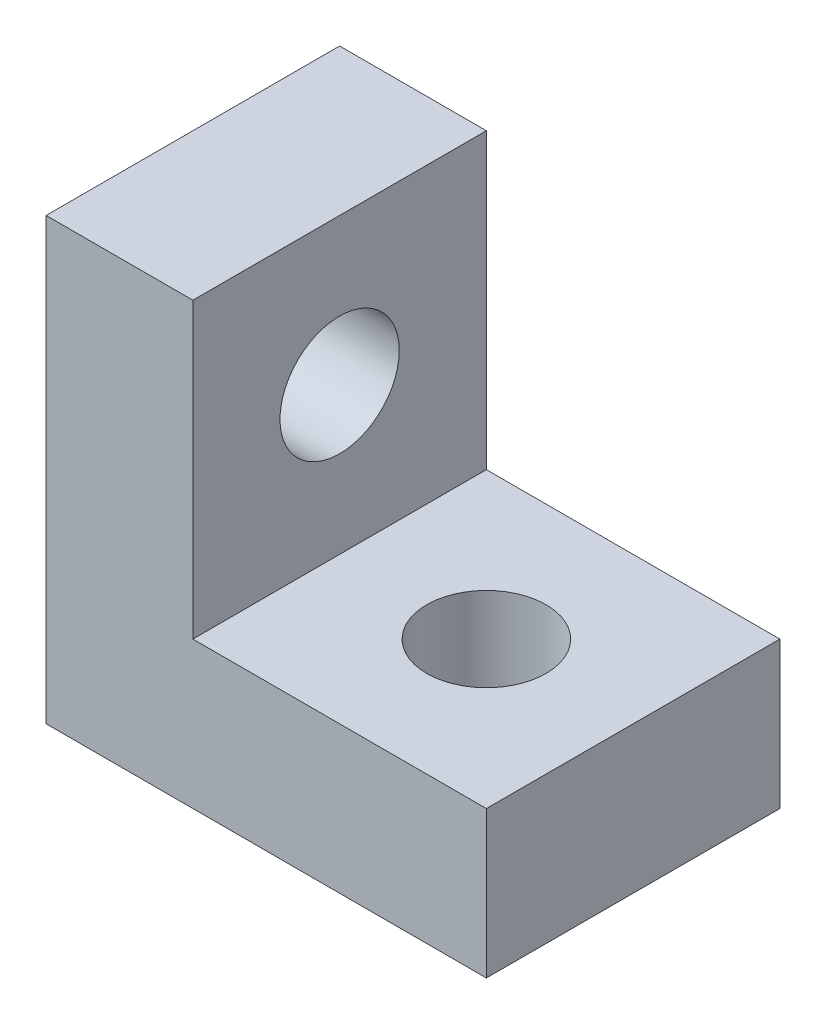
ISO-10303-21;
HEADER;
FILE_DESCRIPTION(('STEP AP214'),'2;1');
FILE_NAME('part.step','',(''),(''),'','','');
FILE_SCHEMA(('AUTOMOTIVE_DESIGN { 1 0 10303 214 1 1 1 1 }'));
ENDSEC;
DATA;
#1=APPLICATION_CONTEXT('core data for automotive mechanical design processes');
#2=APPLICATION_PROTOCOL_DEFINITION('international standard','automotive_design',2000,#1);
#3=PRODUCT_CONTEXT('',#1,'mechanical');
#4=PRODUCT('Part','Part','',(#3));
#5=PRODUCT_RELATED_PRODUCT_CATEGORY('part','',(#4));
#6=PRODUCT_DEFINITION_FORMATION('','',#4);
#7=PRODUCT_DEFINITION_CONTEXT('part definition',#1,'design');
#8=PRODUCT_DEFINITION('design','',#6,#7);
#9=PRODUCT_DEFINITION_SHAPE('','',#8);
#10=(LENGTH_UNIT() NAMED_UNIT(*) SI_UNIT(.MILLI.,.METRE.));
#11=(NAMED_UNIT(*) PLANE_ANGLE_UNIT() SI_UNIT($,.RADIAN.));
#12=(NAMED_UNIT(*) SI_UNIT($,.STERADIAN.) SOLID_ANGLE_UNIT());
#13=UNCERTAINTY_MEASURE_WITH_UNIT(LENGTH_MEASURE(1.E-05),#10,'distance_accuracy_value','');
#14=(GEOMETRIC_REPRESENTATION_CONTEXT(3) GLOBAL_UNCERTAINTY_ASSIGNED_CONTEXT((#13)) GLOBAL_UNIT_ASSIGNED_CONTEXT((#10,
#11,#12)) REPRESENTATION_CONTEXT('',''));
#15=CARTESIAN_POINT('',(0.,0.,0.));
#16=DIRECTION('',(0.,0.,1.));
#17=DIRECTION('',(1.,0.,0.));
#18=AXIS2_PLACEMENT_3D('',#15,#16,#17);
#19=CARTESIAN_POINT('',(0.,0.,12.7));
#20=DIRECTION('',(1.,0.,0.));
#21=DIRECTION('',(0.,0.,-1.));
#22=AXIS2_PLACEMENT_3D('',#19,#20,#21);
#23=PLANE('',#22);
#24=CARTESIAN_POINT('',(0.,12.7,6.35));
#25=DIRECTION('',(1.,0.,0.));
#26=DIRECTION('',(0.,0.,-1.));
#27=AXIS2_PLACEMENT_3D('',#24,#25,#26);
#28=CIRCLE('',#27,2.579751);
#29=CARTESIAN_POINT('',(0.,12.7,3.770249));
#30=VERTEX_POINT('',#29);
#31=EDGE_CURVE('E165',#30,#30,#28,.T.);
#32=ORIENTED_EDGE('',*,*,#31,.T.);
#33=EDGE_LOOP('',(#32));
#34=FACE_BOUND('',#33,.T.);
#35=DIRECTION('',(0.,-1.,0.));
#36=VECTOR('',#35,1.);
#37=CARTESIAN_POINT('',(0.,0.,0.));
#38=LINE('',#37,#36);
#39=CARTESIAN_POINT('',(0.,19.05,0.));
#40=VERTEX_POINT('',#39);
#41=CARTESIAN_POINT('',(0.,0.,0.));
#42=VERTEX_POINT('',#41);
#43=EDGE_CURVE('E121',#40,#42,#38,.T.);
#44=ORIENTED_EDGE('',*,*,#43,.T.);
#45=DIRECTION('',(0.,0.,-1.));
#46=VECTOR('',#45,1.);
#47=CARTESIAN_POINT('',(0.,0.,12.7));
#48=LINE('',#47,#46);
#49=CARTESIAN_POINT('',(0.,0.,12.7));
#50=VERTEX_POINT('',#49);
#51=EDGE_CURVE('E11',#50,#42,#48,.T.);
#52=ORIENTED_EDGE('',*,*,#51,.F.);
#53=DIRECTION('',(0.,-1.,0.));
#54=VECTOR('',#53,1.);
#55=CARTESIAN_POINT('',(0.,0.,12.7));
#56=LINE('',#55,#54);
#57=CARTESIAN_POINT('',(0.,19.05,12.7));
#58=VERTEX_POINT('',#57);
#59=EDGE_CURVE('E132',#58,#50,#56,.T.);
#60=ORIENTED_EDGE('',*,*,#59,.F.);
#61=DIRECTION('',(0.,0.,-1.));
#62=VECTOR('',#61,1.);
#63=CARTESIAN_POINT('',(0.,19.05,12.7));
#64=LINE('',#63,#62);
#65=EDGE_CURVE('E117',#58,#40,#64,.T.);
#66=ORIENTED_EDGE('',*,*,#65,.T.);
#67=EDGE_LOOP('',(#44,#52,#60,#66));
#68=FACE_BOUND('',#67,.T.);
#69=ADVANCED_FACE('F37',(#34,#68),#23,.F.);
#70=CARTESIAN_POINT('',(11.1626315789474,0.,12.7));
#71=DIRECTION('',(0.,1.,0.));
#72=DIRECTION('',(-1.,0.,0.));
#73=AXIS2_PLACEMENT_3D('',#70,#71,#72);
#74=PLANE('',#73);
#75=CARTESIAN_POINT('',(12.7,0.,6.35));
#76=DIRECTION('',(0.,1.,0.));
#77=DIRECTION('',(0.,0.,1.));
#78=AXIS2_PLACEMENT_3D('',#75,#76,#77);
#79=CIRCLE('',#78,2.579751);
#80=CARTESIAN_POINT('',(12.7,0.,8.929751));
#81=VERTEX_POINT('',#80);
#82=EDGE_CURVE('E125',#81,#81,#79,.T.);
#83=ORIENTED_EDGE('',*,*,#82,.T.);
#84=EDGE_LOOP('',(#83));
#85=FACE_BOUND('',#84,.T.);
#86=DIRECTION('',(1.,0.,0.));
#87=VECTOR('',#86,1.);
#88=CARTESIAN_POINT('',(11.1626315789474,0.,0.));
#89=LINE('',#88,#87);
#90=CARTESIAN_POINT('',(19.05,0.,0.));
#91=VERTEX_POINT('',#90);
#92=EDGE_CURVE('E124',#42,#91,#89,.T.);
#93=ORIENTED_EDGE('',*,*,#92,.T.);
#94=DIRECTION('',(0.,0.,-1.));
#95=VECTOR('',#94,1.);
#96=CARTESIAN_POINT('',(19.05,0.,12.7));
#97=LINE('',#96,#95);
#98=CARTESIAN_POINT('',(19.05,0.,12.7));
#99=VERTEX_POINT('',#98);
#100=EDGE_CURVE('E45',#99,#91,#97,.T.);
#101=ORIENTED_EDGE('',*,*,#100,.F.);
#102=DIRECTION('',(1.,0.,0.));
#103=VECTOR('',#102,1.);
#104=CARTESIAN_POINT('',(0.,0.,12.7));
#105=LINE('',#104,#103);
#106=EDGE_CURVE('E90',#50,#99,#105,.T.);
#107=ORIENTED_EDGE('',*,*,#106,.F.);
#108=ORIENTED_EDGE('',*,*,#51,.T.);
#109=EDGE_LOOP('',(#93,#101,#107,#108));
#110=FACE_BOUND('',#109,.T.);
#111=ADVANCED_FACE('F157',(#85,#110),#74,.F.);
#112=CARTESIAN_POINT('',(19.05,0.,12.7));
#113=DIRECTION('',(-1.,0.,0.));
#114=DIRECTION('',(0.,0.,1.));
#115=AXIS2_PLACEMENT_3D('',#112,#113,#114);
#116=PLANE('',#115);
#117=DIRECTION('',(0.,1.,0.));
#118=VECTOR('',#117,1.);
#119=CARTESIAN_POINT('',(19.05,0.,0.));
#120=LINE('',#119,#118);
#121=CARTESIAN_POINT('',(19.05,6.35,0.));
#122=VERTEX_POINT('',#121);
#123=EDGE_CURVE('E127',#91,#122,#120,.T.);
#124=ORIENTED_EDGE('',*,*,#123,.T.);
#125=DIRECTION('',(0.,0.,-1.));
#126=VECTOR('',#125,1.);
#127=CARTESIAN_POINT('',(19.05,6.35,12.7));
#128=LINE('',#127,#126);
#129=CARTESIAN_POINT('',(19.05,6.35,12.7));
#130=VERTEX_POINT('',#129);
#131=EDGE_CURVE('E112',#130,#122,#128,.T.);
#132=ORIENTED_EDGE('',*,*,#131,.F.);
#133=DIRECTION('',(0.,1.,0.));
#134=VECTOR('',#133,1.);
#135=CARTESIAN_POINT('',(19.05,0.,12.7));
#136=LINE('',#135,#134);
#137=EDGE_CURVE('E103',#99,#130,#136,.T.);
#138=ORIENTED_EDGE('',*,*,#137,.F.);
#139=ORIENTED_EDGE('',*,*,#100,.T.);
#140=EDGE_LOOP('',(#124,#132,#138,#139));
#141=FACE_BOUND('',#140,.T.);
#142=ADVANCED_FACE('F138',(#141),#116,.F.);
#143=CARTESIAN_POINT('',(6.35,6.35,12.7));
#144=DIRECTION('',(0.,-1.,0.));
#145=DIRECTION('',(1.,0.,0.));
#146=AXIS2_PLACEMENT_3D('',#143,#144,#145);
#147=PLANE('',#146);
#148=CARTESIAN_POINT('',(12.7,6.35,6.35));
#149=DIRECTION('',(0.,1.,0.));
#150=DIRECTION('',(0.,0.,1.));
#151=AXIS2_PLACEMENT_3D('',#148,#149,#150);
#152=CIRCLE('',#151,2.579751);
#153=CARTESIAN_POINT('',(12.7,6.35,8.929751));
#154=VERTEX_POINT('',#153);
#155=EDGE_CURVE('E167',#154,#154,#152,.T.);
#156=ORIENTED_EDGE('',*,*,#155,.F.);
#157=EDGE_LOOP('',(#156));
#158=FACE_BOUND('',#157,.T.);
#159=DIRECTION('',(-1.,0.,0.));
#160=VECTOR('',#159,1.);
#161=CARTESIAN_POINT('',(6.35,6.35,0.));
#162=LINE('',#161,#160);
#163=CARTESIAN_POINT('',(6.35,6.35,0.));
#164=VERTEX_POINT('',#163);
#165=EDGE_CURVE('E111',#122,#164,#162,.T.);
#166=ORIENTED_EDGE('',*,*,#165,.T.);
#167=DIRECTION('',(0.,0.,-1.));
#168=VECTOR('',#167,1.);
#169=CARTESIAN_POINT('',(6.35,6.35,12.7));
#170=LINE('',#169,#168);
#171=CARTESIAN_POINT('',(6.35,6.35,12.7));
#172=VERTEX_POINT('',#171);
#173=EDGE_CURVE('E108',#172,#164,#170,.T.);
#174=ORIENTED_EDGE('',*,*,#173,.F.);
#175=DIRECTION('',(-1.,0.,0.));
#176=VECTOR('',#175,1.);
#177=CARTESIAN_POINT('',(6.35,6.35,12.7));
#178=LINE('',#177,#176);
#179=EDGE_CURVE('E97',#130,#172,#178,.T.);
#180=ORIENTED_EDGE('',*,*,#179,.F.);
#181=ORIENTED_EDGE('',*,*,#131,.T.);
#182=EDGE_LOOP('',(#166,#174,#180,#181));
#183=FACE_BOUND('',#182,.T.);
#184=ADVANCED_FACE('F109',(#158,#183),#147,.F.);
#185=CARTESIAN_POINT('',(6.35,6.35,12.7));
#186=DIRECTION('',(-1.,0.,0.));
#187=DIRECTION('',(0.,0.,1.));
#188=AXIS2_PLACEMENT_3D('',#185,#186,#187);
#189=PLANE('',#188);
#190=CARTESIAN_POINT('',(6.35,12.7,6.35));
#191=DIRECTION('',(1.,0.,0.));
#192=DIRECTION('',(0.,0.,-1.));
#193=AXIS2_PLACEMENT_3D('',#190,#191,#192);
#194=CIRCLE('',#193,2.579751);
#195=CARTESIAN_POINT('',(6.35,12.7,3.770249));
#196=VERTEX_POINT('',#195);
#197=EDGE_CURVE('E168',#196,#196,#194,.T.);
#198=ORIENTED_EDGE('',*,*,#197,.F.);
#199=EDGE_LOOP('',(#198));
#200=FACE_BOUND('',#199,.T.);
#201=DIRECTION('',(0.,1.,0.));
#202=VECTOR('',#201,1.);
#203=CARTESIAN_POINT('',(6.35,6.35,0.));
#204=LINE('',#203,#202);
#205=CARTESIAN_POINT('',(6.35,19.05,0.));
#206=VERTEX_POINT('',#205);
#207=EDGE_CURVE('E76',#164,#206,#204,.T.);
#208=ORIENTED_EDGE('',*,*,#207,.T.);
#209=DIRECTION('',(0.,0.,-1.));
#210=VECTOR('',#209,1.);
#211=CARTESIAN_POINT('',(6.35,19.05,12.7));
#212=LINE('',#211,#210);
#213=CARTESIAN_POINT('',(6.35,19.05,12.7));
#214=VERTEX_POINT('',#213);
#215=EDGE_CURVE('E113',#214,#206,#212,.T.);
#216=ORIENTED_EDGE('',*,*,#215,.F.);
#217=DIRECTION('',(0.,1.,0.));
#218=VECTOR('',#217,1.);
#219=CARTESIAN_POINT('',(6.35,6.35,12.7));
#220=LINE('',#219,#218);
#221=EDGE_CURVE('E101',#172,#214,#220,.T.);
#222=ORIENTED_EDGE('',*,*,#221,.F.);
#223=ORIENTED_EDGE('',*,*,#173,.T.);
#224=EDGE_LOOP('',(#208,#216,#222,#223));
#225=FACE_BOUND('',#224,.T.);
#226=ADVANCED_FACE('F115',(#200,#225),#189,.F.);
#227=CARTESIAN_POINT('',(0.,19.05,12.7));
#228=DIRECTION('',(0.,-1.,0.));
#229=DIRECTION('',(0.,0.,-1.));
#230=AXIS2_PLACEMENT_3D('',#227,#228,#229);
#231=PLANE('',#230);
#232=DIRECTION('',(-1.,0.,0.));
#233=VECTOR('',#232,1.);
#234=CARTESIAN_POINT('',(0.,19.05,0.));
#235=LINE('',#234,#233);
#236=EDGE_CURVE('E82',#206,#40,#235,.T.);
#237=ORIENTED_EDGE('',*,*,#236,.T.);
#238=ORIENTED_EDGE('',*,*,#65,.F.);
#239=DIRECTION('',(-1.,0.,0.));
#240=VECTOR('',#239,1.);
#241=CARTESIAN_POINT('',(0.,19.05,12.7));
#242=LINE('',#241,#240);
#243=EDGE_CURVE('E53',#214,#58,#242,.T.);
#244=ORIENTED_EDGE('',*,*,#243,.F.);
#245=ORIENTED_EDGE('',*,*,#215,.T.);
#246=EDGE_LOOP('',(#237,#238,#244,#245));
#247=FACE_BOUND('',#246,.T.);
#248=ADVANCED_FACE('F145',(#247),#231,.F.);
#249=CARTESIAN_POINT('',(0.,0.,12.7));
#250=DIRECTION('',(0.,0.,-1.));
#251=DIRECTION('',(-1.,0.,0.));
#252=AXIS2_PLACEMENT_3D('',#249,#250,#251);
#253=PLANE('',#252);
#254=ORIENTED_EDGE('',*,*,#59,.T.);
#255=ORIENTED_EDGE('',*,*,#106,.T.);
#256=ORIENTED_EDGE('',*,*,#137,.T.);
#257=ORIENTED_EDGE('',*,*,#179,.T.);
#258=ORIENTED_EDGE('',*,*,#221,.T.);
#259=ORIENTED_EDGE('',*,*,#243,.T.);
#260=EDGE_LOOP('',(#254,#255,#256,#257,#258,#259));
#261=FACE_BOUND('',#260,.T.);
#262=ADVANCED_FACE('F99',(#261),#253,.F.);
#263=CARTESIAN_POINT('',(0.,0.,0.));
#264=DIRECTION('',(0.,0.,-1.));
#265=DIRECTION('',(-1.,0.,0.));
#266=AXIS2_PLACEMENT_3D('',#263,#264,#265);
#267=PLANE('',#266);
#268=ORIENTED_EDGE('',*,*,#43,.F.);
#269=ORIENTED_EDGE('',*,*,#236,.F.);
#270=ORIENTED_EDGE('',*,*,#207,.F.);
#271=ORIENTED_EDGE('',*,*,#165,.F.);
#272=ORIENTED_EDGE('',*,*,#123,.F.);
#273=ORIENTED_EDGE('',*,*,#92,.F.);
#274=EDGE_LOOP('',(#268,#269,#270,#271,#272,#273));
#275=FACE_BOUND('',#274,.T.);
#276=ADVANCED_FACE('F141',(#275),#267,.T.);
#277=CARTESIAN_POINT('',(12.7,6.35,6.35));
#278=DIRECTION('',(0.,1.,0.));
#279=DIRECTION('',(0.,0.,1.));
#280=AXIS2_PLACEMENT_3D('',#277,#278,#279);
#281=CYLINDRICAL_SURFACE('',#280,2.579751);
#282=ORIENTED_EDGE('',*,*,#82,.F.);
#283=EDGE_LOOP('',(#282));
#284=FACE_BOUND('',#283,.T.);
#285=ORIENTED_EDGE('',*,*,#155,.T.);
#286=EDGE_LOOP('',(#285));
#287=FACE_BOUND('',#286,.T.);
#288=ADVANCED_FACE('F180',(#284,#287),#281,.F.);
#289=CARTESIAN_POINT('',(6.35,12.7,6.35));
#290=DIRECTION('',(1.,0.,0.));
#291=DIRECTION('',(0.,0.,-1.));
#292=AXIS2_PLACEMENT_3D('',#289,#290,#291);
#293=CYLINDRICAL_SURFACE('',#292,2.579751);
#294=ORIENTED_EDGE('',*,*,#31,.F.);
#295=EDGE_LOOP('',(#294));
#296=FACE_BOUND('',#295,.T.);
#297=ORIENTED_EDGE('',*,*,#197,.T.);
#298=EDGE_LOOP('',(#297));
#299=FACE_BOUND('',#298,.T.);
#300=ADVANCED_FACE('F183',(#296,#299),#293,.F.);
#301=CLOSED_SHELL('',(#69,#111,#142,#184,#226,#248,#262,#276,#288,#300));
#302=MANIFOLD_SOLID_BREP('B2',#301);
#303=ADVANCED_BREP_SHAPE_REPRESENTATION('',(#18,#302),#14);
#304=SHAPE_DEFINITION_REPRESENTATION(#9,#303);
ENDSEC;
END-ISO-10303-21;
